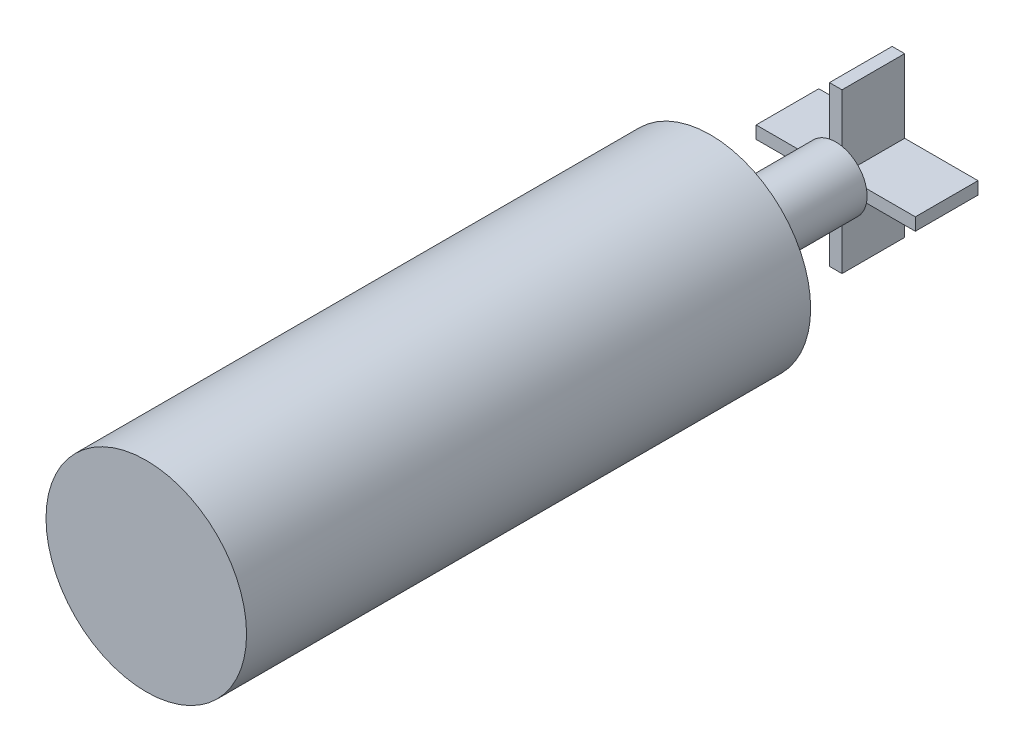
ISO-10303-21;
HEADER;
FILE_DESCRIPTION(('STEP AP214'),'2;1');
FILE_NAME('part.step','',(''),(''),'','','');
FILE_SCHEMA(('AUTOMOTIVE_DESIGN { 1 0 10303 214 1 1 1 1 }'));
ENDSEC;
DATA;
#1=APPLICATION_CONTEXT('core data for automotive mechanical design processes');
#2=APPLICATION_PROTOCOL_DEFINITION('international standard','automotive_design',2000,#1);
#3=PRODUCT_CONTEXT('',#1,'mechanical');
#4=PRODUCT('Part','Part','',(#3));
#5=PRODUCT_RELATED_PRODUCT_CATEGORY('part','',(#4));
#6=PRODUCT_DEFINITION_FORMATION('','',#4);
#7=PRODUCT_DEFINITION_CONTEXT('part definition',#1,'design');
#8=PRODUCT_DEFINITION('design','',#6,#7);
#9=PRODUCT_DEFINITION_SHAPE('','',#8);
#10=(LENGTH_UNIT() NAMED_UNIT(*) SI_UNIT(.MILLI.,.METRE.));
#11=(NAMED_UNIT(*) PLANE_ANGLE_UNIT() SI_UNIT($,.RADIAN.));
#12=(NAMED_UNIT(*) SI_UNIT($,.STERADIAN.) SOLID_ANGLE_UNIT());
#13=UNCERTAINTY_MEASURE_WITH_UNIT(LENGTH_MEASURE(1.E-05),#10,'distance_accuracy_value','');
#14=(GEOMETRIC_REPRESENTATION_CONTEXT(3) GLOBAL_UNCERTAINTY_ASSIGNED_CONTEXT((#13)) GLOBAL_UNIT_ASSIGNED_CONTEXT((#10,
#11,#12)) REPRESENTATION_CONTEXT('',''));
#15=CARTESIAN_POINT('',(0.,0.,0.));
#16=DIRECTION('',(0.,0.,1.));
#17=DIRECTION('',(1.,0.,0.));
#18=AXIS2_PLACEMENT_3D('',#15,#16,#17);
#19=CARTESIAN_POINT('',(0.,0.,-20.));
#20=DIRECTION('',(0.,0.,-1.));
#21=DIRECTION('',(-1.,0.,0.));
#22=AXIS2_PLACEMENT_3D('',#19,#20,#21);
#23=PLANE('',#22);
#24=DIRECTION('',(-1.,0.,0.));
#25=VECTOR('',#24,1.);
#26=CARTESIAN_POINT('',(-1.,-1.,-20.));
#27=LINE('',#26,#25);
#28=CARTESIAN_POINT('',(-1.,-1.,-20.));
#29=VERTEX_POINT('',#28);
#30=CARTESIAN_POINT('',(-4.89897948556636,-1.,-20.));
#31=VERTEX_POINT('',#30);
#32=EDGE_CURVE('E53',#29,#31,#27,.T.);
#33=ORIENTED_EDGE('',*,*,#32,.F.);
#34=DIRECTION('',(0.,1.,0.));
#35=VECTOR('',#34,1.);
#36=CARTESIAN_POINT('',(-1.,-1.,-20.));
#37=LINE('',#36,#35);
#38=CARTESIAN_POINT('',(-1.,-4.89897948556636,-20.));
#39=VERTEX_POINT('',#38);
#40=EDGE_CURVE('E11',#39,#29,#37,.T.);
#41=ORIENTED_EDGE('',*,*,#40,.F.);
#42=CARTESIAN_POINT('',(0.,0.,-20.));
#43=DIRECTION('',(0.,0.,-1.));
#44=DIRECTION('',(-1.,0.,0.));
#45=AXIS2_PLACEMENT_3D('',#42,#43,#44);
#46=CIRCLE('',#45,5.);
#47=EDGE_CURVE('E179',#39,#31,#46,.T.);
#48=ORIENTED_EDGE('',*,*,#47,.T.);
#49=EDGE_LOOP('',(#33,#41,#48));
#50=FACE_BOUND('',#49,.T.);
#51=ADVANCED_FACE('F35',(#50),#23,.T.);
#52=DIRECTION('',(0.,-1.,0.));
#53=VECTOR('',#52,1.);
#54=CARTESIAN_POINT('',(1.,-1.,-20.));
#55=LINE('',#54,#53);
#56=CARTESIAN_POINT('',(1.,-1.,-20.));
#57=VERTEX_POINT('',#56);
#58=CARTESIAN_POINT('',(1.,-4.89897948556636,-20.));
#59=VERTEX_POINT('',#58);
#60=EDGE_CURVE('E60',#57,#59,#55,.T.);
#61=ORIENTED_EDGE('',*,*,#60,.F.);
#62=DIRECTION('',(-1.,0.,0.));
#63=VECTOR('',#62,1.);
#64=CARTESIAN_POINT('',(12.7,-1.,-20.));
#65=LINE('',#64,#63);
#66=CARTESIAN_POINT('',(4.89897948556636,-1.,-20.));
#67=VERTEX_POINT('',#66);
#68=EDGE_CURVE('E44',#67,#57,#65,.T.);
#69=ORIENTED_EDGE('',*,*,#68,.F.);
#70=EDGE_CURVE('E366',#67,#59,#46,.T.);
#71=ORIENTED_EDGE('',*,*,#70,.T.);
#72=EDGE_LOOP('',(#61,#69,#71));
#73=FACE_BOUND('',#72,.T.);
#74=ADVANCED_FACE('F214',(#73),#23,.T.);
#75=DIRECTION('',(1.,0.,0.));
#76=VECTOR('',#75,1.);
#77=CARTESIAN_POINT('',(12.7,1.,-20.));
#78=LINE('',#77,#76);
#79=CARTESIAN_POINT('',(1.,1.,-20.));
#80=VERTEX_POINT('',#79);
#81=CARTESIAN_POINT('',(4.89897948556636,1.,-20.));
#82=VERTEX_POINT('',#81);
#83=EDGE_CURVE('E239',#80,#82,#78,.T.);
#84=ORIENTED_EDGE('',*,*,#83,.F.);
#85=DIRECTION('',(0.,-1.,0.));
#86=VECTOR('',#85,1.);
#87=CARTESIAN_POINT('',(1.,12.7,-20.));
#88=LINE('',#87,#86);
#89=CARTESIAN_POINT('',(1.,4.89897948556636,-20.));
#90=VERTEX_POINT('',#89);
#91=EDGE_CURVE('E241',#90,#80,#88,.T.);
#92=ORIENTED_EDGE('',*,*,#91,.F.);
#93=EDGE_CURVE('E243',#90,#82,#46,.T.);
#94=ORIENTED_EDGE('',*,*,#93,.T.);
#95=EDGE_LOOP('',(#84,#92,#94));
#96=FACE_BOUND('',#95,.T.);
#97=ADVANCED_FACE('F219',(#96),#23,.T.);
#98=CARTESIAN_POINT('',(0.,0.,90.));
#99=DIRECTION('',(0.,0.,-1.));
#100=DIRECTION('',(-1.,0.,0.));
#101=AXIS2_PLACEMENT_3D('',#98,#99,#100);
#102=CYLINDRICAL_SURFACE('',#101,16.);
#103=CARTESIAN_POINT('',(0.,0.,90.));
#104=DIRECTION('',(0.,0.,1.));
#105=DIRECTION('',(1.,0.,0.));
#106=AXIS2_PLACEMENT_3D('',#103,#104,#105);
#107=CIRCLE('',#106,16.);
#108=CARTESIAN_POINT('',(-16.,0.,90.));
#109=VERTEX_POINT('',#108);
#110=EDGE_CURVE('E191',#109,#109,#107,.T.);
#111=CARTESIAN_POINT('',(0.,0.,0.));
#112=DIRECTION('',(0.,0.,1.));
#113=DIRECTION('',(1.,0.,0.));
#114=AXIS2_PLACEMENT_3D('',#111,#112,#113);
#115=CIRCLE('',#114,16.);
#116=CARTESIAN_POINT('',(-16.,0.,0.));
#117=VERTEX_POINT('',#116);
#118=EDGE_CURVE('E39',#117,#117,#115,.T.);
#119=CARTESIAN_POINT('',(-16.,0.,90.));
#120=CARTESIAN_POINT('',(-16.,0.,89.0625));
#121=CARTESIAN_POINT('',(-16.,0.,88.125));
#122=CARTESIAN_POINT('',(-16.,0.,86.25));
#123=CARTESIAN_POINT('',(-16.,0.,85.3125));
#124=CARTESIAN_POINT('',(-16.,0.,83.4375));
#125=CARTESIAN_POINT('',(-16.,0.,82.5));
#126=CARTESIAN_POINT('',(-16.,0.,80.625));
#127=CARTESIAN_POINT('',(-16.,0.,79.6875));
#128=CARTESIAN_POINT('',(-16.,0.,77.8125));
#129=CARTESIAN_POINT('',(-16.,0.,76.875));
#130=CARTESIAN_POINT('',(-16.,0.,75.));
#131=CARTESIAN_POINT('',(-16.,0.,74.0625));
#132=CARTESIAN_POINT('',(-16.,0.,72.1875));
#133=CARTESIAN_POINT('',(-16.,0.,71.25));
#134=CARTESIAN_POINT('',(-16.,0.,69.375));
#135=CARTESIAN_POINT('',(-16.,0.,68.4375));
#136=CARTESIAN_POINT('',(-16.,0.,66.5625));
#137=CARTESIAN_POINT('',(-16.,0.,65.625));
#138=CARTESIAN_POINT('',(-16.,0.,63.75));
#139=CARTESIAN_POINT('',(-16.,0.,62.8125));
#140=CARTESIAN_POINT('',(-16.,0.,60.9375));
#141=CARTESIAN_POINT('',(-16.,0.,60.));
#142=CARTESIAN_POINT('',(-16.,0.,58.125));
#143=CARTESIAN_POINT('',(-16.,0.,57.1875));
#144=CARTESIAN_POINT('',(-16.,0.,55.3125));
#145=CARTESIAN_POINT('',(-16.,0.,54.375));
#146=CARTESIAN_POINT('',(-16.,0.,52.5));
#147=CARTESIAN_POINT('',(-16.,0.,51.5625));
#148=CARTESIAN_POINT('',(-16.,0.,49.6875));
#149=CARTESIAN_POINT('',(-16.,0.,48.75));
#150=CARTESIAN_POINT('',(-16.,0.,46.875));
#151=CARTESIAN_POINT('',(-16.,0.,45.9375));
#152=CARTESIAN_POINT('',(-16.,0.,44.0625));
#153=CARTESIAN_POINT('',(-16.,0.,43.125));
#154=CARTESIAN_POINT('',(-16.,0.,41.25));
#155=CARTESIAN_POINT('',(-16.,0.,40.3125));
#156=CARTESIAN_POINT('',(-16.,0.,38.4375));
#157=CARTESIAN_POINT('',(-16.,0.,37.5));
#158=CARTESIAN_POINT('',(-16.,0.,35.625));
#159=CARTESIAN_POINT('',(-16.,0.,34.6875));
#160=CARTESIAN_POINT('',(-16.,0.,32.8125));
#161=CARTESIAN_POINT('',(-16.,0.,31.875));
#162=CARTESIAN_POINT('',(-16.,0.,30.));
#163=CARTESIAN_POINT('',(-16.,0.,29.0625));
#164=CARTESIAN_POINT('',(-16.,0.,27.1875));
#165=CARTESIAN_POINT('',(-16.,0.,26.25));
#166=CARTESIAN_POINT('',(-16.,0.,24.375));
#167=CARTESIAN_POINT('',(-16.,0.,23.4375));
#168=CARTESIAN_POINT('',(-16.,0.,21.5625));
#169=CARTESIAN_POINT('',(-16.,0.,20.625));
#170=CARTESIAN_POINT('',(-16.,0.,18.75));
#171=CARTESIAN_POINT('',(-16.,0.,17.8125));
#172=CARTESIAN_POINT('',(-16.,0.,15.9375));
#173=CARTESIAN_POINT('',(-16.,0.,15.));
#174=CARTESIAN_POINT('',(-16.,0.,13.125));
#175=CARTESIAN_POINT('',(-16.,0.,12.1875));
#176=CARTESIAN_POINT('',(-16.,0.,10.3125));
#177=CARTESIAN_POINT('',(-16.,0.,9.37499999999999));
#178=CARTESIAN_POINT('',(-16.,0.,7.49999999999999));
#179=CARTESIAN_POINT('',(-16.,0.,6.56249999999999));
#180=CARTESIAN_POINT('',(-16.,0.,4.68749999999999));
#181=CARTESIAN_POINT('',(-16.,0.,3.74999999999998));
#182=CARTESIAN_POINT('',(-16.,0.,1.87499999999998));
#183=CARTESIAN_POINT('',(-16.,0.,0.937499999999986));
#184=CARTESIAN_POINT('',(-16.,0.,0.));
#185=B_SPLINE_CURVE_WITH_KNOTS('',3,(#119,#120,#121,#122,#123,#124,#125,#126,#127,#128,#129,
#130,#131,#132,#133,#134,#135,#136,#137,#138,#139,#140,#141,#142,#143,#144,#145,#146,#147,#148,
#149,#150,#151,#152,#153,#154,#155,#156,#157,#158,#159,#160,#161,#162,#163,#164,#165,#166,#167,
#168,#169,#170,#171,#172,#173,#174,#175,#176,#177,#178,#179,#180,#181,#182,#183,#184),
.UNSPECIFIED.,.F.,.F.,(4,2,2,2,2,2,2,2,2,2,2,2,2,2,2,2,2,2,2,2,2,2,2,2,2,2,2,2,2,2,2,2,4),(0.,
2.81250000000001,5.62500000000001,8.43750000000001,11.25,14.0625,16.875,19.6875,22.5,25.3125,
28.125,30.9375,33.75,36.5625,39.375,42.1875,45.,47.8125,50.625,53.4375,56.25,59.0625,61.875,
64.6875,67.5,70.3125,73.125,75.9375,78.75,81.5625,84.375,87.1875,90.),.UNSPECIFIED.);
#186=EDGE_CURVE('BSEAM37',#109,#117,#185,.T.);
#187=ORIENTED_EDGE('',*,*,#110,.F.);
#188=ORIENTED_EDGE('',*,*,#118,.T.);
#189=ORIENTED_EDGE('',*,*,#186,.T.);
#190=ORIENTED_EDGE('',*,*,#186,.F.);
#191=EDGE_LOOP('',(#187,#189,#188,#190));
#192=FACE_BOUND('',#191,.T.);
#193=ADVANCED_FACE('F37',(#192),#102,.T.);
#194=CARTESIAN_POINT('',(0.,0.,90.));
#195=DIRECTION('',(0.,0.,1.));
#196=DIRECTION('',(1.,0.,0.));
#197=AXIS2_PLACEMENT_3D('',#194,#195,#196);
#198=PLANE('',#197);
#199=ORIENTED_EDGE('',*,*,#110,.T.);
#200=EDGE_LOOP('',(#199));
#201=FACE_BOUND('',#200,.T.);
#202=ADVANCED_FACE('F202',(#201),#198,.T.);
#203=CARTESIAN_POINT('',(0.,0.,0.));
#204=DIRECTION('',(0.,0.,1.));
#205=DIRECTION('',(1.,0.,0.));
#206=AXIS2_PLACEMENT_3D('',#203,#204,#205);
#207=PLANE('',#206);
#208=CARTESIAN_POINT('',(0.,0.,0.));
#209=DIRECTION('',(0.,0.,-1.));
#210=DIRECTION('',(-1.,0.,0.));
#211=AXIS2_PLACEMENT_3D('',#208,#209,#210);
#212=CIRCLE('',#211,5.);
#213=CARTESIAN_POINT('',(-5.,0.,0.));
#214=VERTEX_POINT('',#213);
#215=EDGE_CURVE('E188',#214,#214,#212,.T.);
#216=ORIENTED_EDGE('',*,*,#215,.F.);
#217=EDGE_LOOP('',(#216));
#218=FACE_BOUND('',#217,.T.);
#219=ORIENTED_EDGE('',*,*,#118,.F.);
#220=EDGE_LOOP('',(#219));
#221=FACE_BOUND('',#220,.T.);
#222=ADVANCED_FACE('F199',(#218,#221),#207,.F.);
#223=CARTESIAN_POINT('',(0.,0.,-20.));
#224=DIRECTION('',(0.,0.,1.));
#225=DIRECTION('',(1.,0.,0.));
#226=AXIS2_PLACEMENT_3D('',#223,#224,#225);
#227=CYLINDRICAL_SURFACE('',#226,5.);
#228=CARTESIAN_POINT('',(-4.89897948556636,1.,-20.));
#229=VERTEX_POINT('',#228);
#230=CARTESIAN_POINT('',(-0.999999999999999,4.89897948556636,-20.));
#231=VERTEX_POINT('',#230);
#232=EDGE_CURVE('E181',#229,#231,#46,.T.);
#233=ORIENTED_EDGE('',*,*,#232,.F.);
#234=EDGE_CURVE('E176',#31,#229,#46,.T.);
#235=ORIENTED_EDGE('',*,*,#234,.F.);
#236=ORIENTED_EDGE('',*,*,#47,.F.);
#237=EDGE_CURVE('E372',#59,#39,#46,.T.);
#238=ORIENTED_EDGE('',*,*,#237,.F.);
#239=ORIENTED_EDGE('',*,*,#70,.F.);
#240=EDGE_CURVE('E369',#82,#67,#46,.T.);
#241=ORIENTED_EDGE('',*,*,#240,.F.);
#242=ORIENTED_EDGE('',*,*,#93,.F.);
#243=EDGE_CURVE('E187',#231,#90,#46,.T.);
#244=ORIENTED_EDGE('',*,*,#243,.F.);
#245=EDGE_LOOP('',(#233,#235,#236,#238,#239,#241,#242,#244));
#246=FACE_BOUND('',#245,.T.);
#247=ORIENTED_EDGE('',*,*,#215,.T.);
#248=EDGE_LOOP('',(#247));
#249=FACE_BOUND('',#248,.T.);
#250=ADVANCED_FACE('F201',(#246,#249),#227,.T.);
#251=DIRECTION('',(0.,1.,0.));
#252=VECTOR('',#251,1.);
#253=CARTESIAN_POINT('',(-0.999999999999999,12.7,-20.));
#254=LINE('',#253,#252);
#255=CARTESIAN_POINT('',(-1.,1.,-20.));
#256=VERTEX_POINT('',#255);
#257=EDGE_CURVE('E281',#256,#231,#254,.T.);
#258=ORIENTED_EDGE('',*,*,#257,.F.);
#259=DIRECTION('',(1.,0.,0.));
#260=VECTOR('',#259,1.);
#261=CARTESIAN_POINT('',(-1.,1.,-20.));
#262=LINE('',#261,#260);
#263=EDGE_CURVE('E190',#229,#256,#262,.T.);
#264=ORIENTED_EDGE('',*,*,#263,.F.);
#265=ORIENTED_EDGE('',*,*,#232,.T.);
#266=EDGE_LOOP('',(#258,#264,#265));
#267=FACE_BOUND('',#266,.T.);
#268=ADVANCED_FACE('F208',(#267),#23,.T.);
#269=CARTESIAN_POINT('',(0.,0.,-20.));
#270=DIRECTION('',(0.,0.,1.));
#271=DIRECTION('',(1.,0.,0.));
#272=AXIS2_PLACEMENT_3D('',#269,#270,#271);
#273=PLANE('',#272);
#274=CARTESIAN_POINT('',(-0.999999999999999,12.7,-20.));
#275=VERTEX_POINT('',#274);
#276=EDGE_CURVE('E294',#231,#275,#254,.T.);
#277=ORIENTED_EDGE('',*,*,#276,.F.);
#278=ORIENTED_EDGE('',*,*,#243,.T.);
#279=CARTESIAN_POINT('',(1.,12.7,-20.));
#280=VERTEX_POINT('',#279);
#281=EDGE_CURVE('E259',#280,#90,#88,.T.);
#282=ORIENTED_EDGE('',*,*,#281,.F.);
#283=DIRECTION('',(1.,0.,0.));
#284=VECTOR('',#283,1.);
#285=CARTESIAN_POINT('',(1.,12.7,-20.));
#286=LINE('',#285,#284);
#287=EDGE_CURVE('E320',#275,#280,#286,.T.);
#288=ORIENTED_EDGE('',*,*,#287,.F.);
#289=EDGE_LOOP('',(#277,#278,#282,#288));
#290=FACE_BOUND('',#289,.T.);
#291=ADVANCED_FACE('F222',(#290),#273,.T.);
#292=CARTESIAN_POINT('',(12.7,1.,-20.));
#293=VERTEX_POINT('',#292);
#294=EDGE_CURVE('E248',#82,#293,#78,.T.);
#295=ORIENTED_EDGE('',*,*,#294,.F.);
#296=ORIENTED_EDGE('',*,*,#240,.T.);
#297=CARTESIAN_POINT('',(12.7,-1.,-20.));
#298=VERTEX_POINT('',#297);
#299=EDGE_CURVE('E361',#298,#67,#65,.T.);
#300=ORIENTED_EDGE('',*,*,#299,.F.);
#301=DIRECTION('',(0.,-1.,0.));
#302=VECTOR('',#301,1.);
#303=CARTESIAN_POINT('',(12.7,1.,-20.));
#304=LINE('',#303,#302);
#305=EDGE_CURVE('E247',#293,#298,#304,.T.);
#306=ORIENTED_EDGE('',*,*,#305,.F.);
#307=EDGE_LOOP('',(#295,#296,#300,#306));
#308=FACE_BOUND('',#307,.T.);
#309=ADVANCED_FACE('F227',(#308),#273,.T.);
#310=CARTESIAN_POINT('',(0.999999999999999,-12.7,-20.));
#311=VERTEX_POINT('',#310);
#312=EDGE_CURVE('E344',#59,#311,#55,.T.);
#313=ORIENTED_EDGE('',*,*,#312,.F.);
#314=ORIENTED_EDGE('',*,*,#237,.T.);
#315=CARTESIAN_POINT('',(-1.,-12.7,-20.));
#316=VERTEX_POINT('',#315);
#317=EDGE_CURVE('E46',#316,#39,#37,.T.);
#318=ORIENTED_EDGE('',*,*,#317,.F.);
#319=DIRECTION('',(-1.,0.,0.));
#320=VECTOR('',#319,1.);
#321=CARTESIAN_POINT('',(0.999999999999999,-12.7,-20.));
#322=LINE('',#321,#320);
#323=EDGE_CURVE('E351',#311,#316,#322,.T.);
#324=ORIENTED_EDGE('',*,*,#323,.F.);
#325=EDGE_LOOP('',(#313,#314,#318,#324));
#326=FACE_BOUND('',#325,.T.);
#327=ADVANCED_FACE('F377',(#326),#273,.T.);
#328=CARTESIAN_POINT('',(-1.,-1.,-30.));
#329=DIRECTION('',(0.,1.,0.));
#330=DIRECTION('',(0.,0.,1.));
#331=AXIS2_PLACEMENT_3D('',#328,#329,#330);
#332=PLANE('',#331);
#333=ORIENTED_EDGE('',*,*,#32,.T.);
#334=CARTESIAN_POINT('',(-12.7,-1.,-20.));
#335=VERTEX_POINT('',#334);
#336=EDGE_CURVE('E174',#31,#335,#27,.T.);
#337=ORIENTED_EDGE('',*,*,#336,.T.);
#338=DIRECTION('',(0.,0.,1.));
#339=VECTOR('',#338,1.);
#340=CARTESIAN_POINT('',(-12.7,-1.,-30.));
#341=LINE('',#340,#339);
#342=CARTESIAN_POINT('',(-12.7,-1.,-30.));
#343=VERTEX_POINT('',#342);
#344=EDGE_CURVE('E156',#343,#335,#341,.T.);
#345=ORIENTED_EDGE('',*,*,#344,.F.);
#346=DIRECTION('',(-1.,0.,0.));
#347=VECTOR('',#346,1.);
#348=CARTESIAN_POINT('',(-1.,-1.,-30.));
#349=LINE('',#348,#347);
#350=CARTESIAN_POINT('',(-1.,-1.,-30.));
#351=VERTEX_POINT('',#350);
#352=EDGE_CURVE('E162',#351,#343,#349,.T.);
#353=ORIENTED_EDGE('',*,*,#352,.F.);
#354=DIRECTION('',(0.,0.,1.));
#355=VECTOR('',#354,1.);
#356=CARTESIAN_POINT('',(-1.,-1.,-30.));
#357=LINE('',#356,#355);
#358=EDGE_CURVE('E299',#351,#29,#357,.T.);
#359=ORIENTED_EDGE('',*,*,#358,.T.);
#360=EDGE_LOOP('',(#333,#337,#345,#353,#359));
#361=FACE_BOUND('',#360,.T.);
#362=ADVANCED_FACE('F172',(#361),#332,.F.);
#363=CARTESIAN_POINT('',(-12.7,1.,-30.));
#364=DIRECTION('',(1.,0.,0.));
#365=DIRECTION('',(0.,0.,-1.));
#366=AXIS2_PLACEMENT_3D('',#363,#364,#365);
#367=PLANE('',#366);
#368=DIRECTION('',(0.,1.,0.));
#369=VECTOR('',#368,1.);
#370=CARTESIAN_POINT('',(-12.7,1.,-20.));
#371=LINE('',#370,#369);
#372=CARTESIAN_POINT('',(-12.7,1.,-20.));
#373=VERTEX_POINT('',#372);
#374=EDGE_CURVE('E295',#335,#373,#371,.T.);
#375=ORIENTED_EDGE('',*,*,#374,.T.);
#376=DIRECTION('',(0.,0.,1.));
#377=VECTOR('',#376,1.);
#378=CARTESIAN_POINT('',(-12.7,1.,-30.));
#379=LINE('',#378,#377);
#380=CARTESIAN_POINT('',(-12.7,1.,-30.));
#381=VERTEX_POINT('',#380);
#382=EDGE_CURVE('E158',#381,#373,#379,.T.);
#383=ORIENTED_EDGE('',*,*,#382,.F.);
#384=DIRECTION('',(0.,1.,0.));
#385=VECTOR('',#384,1.);
#386=CARTESIAN_POINT('',(-12.7,1.,-30.));
#387=LINE('',#386,#385);
#388=EDGE_CURVE('E152',#343,#381,#387,.T.);
#389=ORIENTED_EDGE('',*,*,#388,.F.);
#390=ORIENTED_EDGE('',*,*,#344,.T.);
#391=EDGE_LOOP('',(#375,#383,#389,#390));
#392=FACE_BOUND('',#391,.T.);
#393=ADVANCED_FACE('F154',(#392),#367,.F.);
#394=CARTESIAN_POINT('',(-1.,1.,-30.));
#395=DIRECTION('',(0.,-1.,0.));
#396=DIRECTION('',(1.,0.,0.));
#397=AXIS2_PLACEMENT_3D('',#394,#395,#396);
#398=PLANE('',#397);
#399=EDGE_CURVE('E289',#373,#229,#262,.T.);
#400=ORIENTED_EDGE('',*,*,#399,.T.);
#401=ORIENTED_EDGE('',*,*,#263,.T.);
#402=DIRECTION('',(0.,0.,1.));
#403=VECTOR('',#402,1.);
#404=CARTESIAN_POINT('',(-1.,1.,-30.));
#405=LINE('',#404,#403);
#406=CARTESIAN_POINT('',(-1.,1.,-30.));
#407=VERTEX_POINT('',#406);
#408=EDGE_CURVE('E182',#407,#256,#405,.T.);
#409=ORIENTED_EDGE('',*,*,#408,.F.);
#410=DIRECTION('',(1.,0.,0.));
#411=VECTOR('',#410,1.);
#412=CARTESIAN_POINT('',(-1.,1.,-30.));
#413=LINE('',#412,#411);
#414=EDGE_CURVE('E161',#381,#407,#413,.T.);
#415=ORIENTED_EDGE('',*,*,#414,.F.);
#416=ORIENTED_EDGE('',*,*,#382,.T.);
#417=EDGE_LOOP('',(#400,#401,#409,#415,#416));
#418=FACE_BOUND('',#417,.T.);
#419=ADVANCED_FACE('F287',(#418),#398,.F.);
#420=CARTESIAN_POINT('',(-0.999999999999999,12.7,-30.));
#421=DIRECTION('',(1.,0.,0.));
#422=DIRECTION('',(0.,1.,0.));
#423=AXIS2_PLACEMENT_3D('',#420,#421,#422);
#424=PLANE('',#423);
#425=ORIENTED_EDGE('',*,*,#257,.T.);
#426=ORIENTED_EDGE('',*,*,#276,.T.);
#427=DIRECTION('',(0.,0.,1.));
#428=VECTOR('',#427,1.);
#429=CARTESIAN_POINT('',(-0.999999999999999,12.7,-30.));
#430=LINE('',#429,#428);
#431=CARTESIAN_POINT('',(-0.999999999999999,12.7,-30.));
#432=VERTEX_POINT('',#431);
#433=EDGE_CURVE('E267',#432,#275,#430,.T.);
#434=ORIENTED_EDGE('',*,*,#433,.F.);
#435=DIRECTION('',(0.,1.,0.));
#436=VECTOR('',#435,1.);
#437=CARTESIAN_POINT('',(-0.999999999999999,12.7,-30.));
#438=LINE('',#437,#436);
#439=EDGE_CURVE('E283',#407,#432,#438,.T.);
#440=ORIENTED_EDGE('',*,*,#439,.F.);
#441=ORIENTED_EDGE('',*,*,#408,.T.);
#442=EDGE_LOOP('',(#425,#426,#434,#440,#441));
#443=FACE_BOUND('',#442,.T.);
#444=ADVANCED_FACE('F280',(#443),#424,.F.);
#445=CARTESIAN_POINT('',(1.,12.7,-30.));
#446=DIRECTION('',(0.,-1.,0.));
#447=DIRECTION('',(0.,0.,-1.));
#448=AXIS2_PLACEMENT_3D('',#445,#446,#447);
#449=PLANE('',#448);
#450=ORIENTED_EDGE('',*,*,#287,.T.);
#451=DIRECTION('',(0.,0.,1.));
#452=VECTOR('',#451,1.);
#453=CARTESIAN_POINT('',(1.,12.7,-30.));
#454=LINE('',#453,#452);
#455=CARTESIAN_POINT('',(1.,12.7,-30.));
#456=VERTEX_POINT('',#455);
#457=EDGE_CURVE('E264',#456,#280,#454,.T.);
#458=ORIENTED_EDGE('',*,*,#457,.F.);
#459=DIRECTION('',(1.,0.,0.));
#460=VECTOR('',#459,1.);
#461=CARTESIAN_POINT('',(1.,12.7,-30.));
#462=LINE('',#461,#460);
#463=EDGE_CURVE('E311',#432,#456,#462,.T.);
#464=ORIENTED_EDGE('',*,*,#463,.F.);
#465=ORIENTED_EDGE('',*,*,#433,.T.);
#466=EDGE_LOOP('',(#450,#458,#464,#465));
#467=FACE_BOUND('',#466,.T.);
#468=ADVANCED_FACE('F319',(#467),#449,.F.);
#469=CARTESIAN_POINT('',(1.,12.7,-30.));
#470=DIRECTION('',(-1.,0.,0.));
#471=DIRECTION('',(0.,-1.,0.));
#472=AXIS2_PLACEMENT_3D('',#469,#470,#471);
#473=PLANE('',#472);
#474=ORIENTED_EDGE('',*,*,#281,.T.);
#475=ORIENTED_EDGE('',*,*,#91,.T.);
#476=DIRECTION('',(0.,0.,1.));
#477=VECTOR('',#476,1.);
#478=CARTESIAN_POINT('',(1.,1.,-30.));
#479=LINE('',#478,#477);
#480=CARTESIAN_POINT('',(1.,1.,-30.));
#481=VERTEX_POINT('',#480);
#482=EDGE_CURVE('E255',#481,#80,#479,.T.);
#483=ORIENTED_EDGE('',*,*,#482,.F.);
#484=DIRECTION('',(0.,-1.,0.));
#485=VECTOR('',#484,1.);
#486=CARTESIAN_POINT('',(1.,12.7,-30.));
#487=LINE('',#486,#485);
#488=EDGE_CURVE('E309',#456,#481,#487,.T.);
#489=ORIENTED_EDGE('',*,*,#488,.F.);
#490=ORIENTED_EDGE('',*,*,#457,.T.);
#491=EDGE_LOOP('',(#474,#475,#483,#489,#490));
#492=FACE_BOUND('',#491,.T.);
#493=ADVANCED_FACE('F253',(#492),#473,.F.);
#494=CARTESIAN_POINT('',(12.7,1.,-30.));
#495=DIRECTION('',(0.,-1.,0.));
#496=DIRECTION('',(1.,0.,0.));
#497=AXIS2_PLACEMENT_3D('',#494,#495,#496);
#498=PLANE('',#497);
#499=ORIENTED_EDGE('',*,*,#83,.T.);
#500=ORIENTED_EDGE('',*,*,#294,.T.);
#501=DIRECTION('',(0.,0.,1.));
#502=VECTOR('',#501,1.);
#503=CARTESIAN_POINT('',(12.7,1.,-30.));
#504=LINE('',#503,#502);
#505=CARTESIAN_POINT('',(12.7,1.,-30.));
#506=VERTEX_POINT('',#505);
#507=EDGE_CURVE('E265',#506,#293,#504,.T.);
#508=ORIENTED_EDGE('',*,*,#507,.F.);
#509=DIRECTION('',(1.,0.,0.));
#510=VECTOR('',#509,1.);
#511=CARTESIAN_POINT('',(12.7,1.,-30.));
#512=LINE('',#511,#510);
#513=EDGE_CURVE('E263',#481,#506,#512,.T.);
#514=ORIENTED_EDGE('',*,*,#513,.F.);
#515=ORIENTED_EDGE('',*,*,#482,.T.);
#516=EDGE_LOOP('',(#499,#500,#508,#514,#515));
#517=FACE_BOUND('',#516,.T.);
#518=ADVANCED_FACE('F261',(#517),#498,.F.);
#519=CARTESIAN_POINT('',(12.7,1.,-30.));
#520=DIRECTION('',(-1.,0.,0.));
#521=DIRECTION('',(0.,0.,1.));
#522=AXIS2_PLACEMENT_3D('',#519,#520,#521);
#523=PLANE('',#522);
#524=ORIENTED_EDGE('',*,*,#305,.T.);
#525=DIRECTION('',(0.,0.,1.));
#526=VECTOR('',#525,1.);
#527=CARTESIAN_POINT('',(12.7,-1.,-30.));
#528=LINE('',#527,#526);
#529=CARTESIAN_POINT('',(12.7,-1.,-30.));
#530=VERTEX_POINT('',#529);
#531=EDGE_CURVE('E270',#530,#298,#528,.T.);
#532=ORIENTED_EDGE('',*,*,#531,.F.);
#533=DIRECTION('',(0.,-1.,0.));
#534=VECTOR('',#533,1.);
#535=CARTESIAN_POINT('',(12.7,1.,-30.));
#536=LINE('',#535,#534);
#537=EDGE_CURVE('E306',#506,#530,#536,.T.);
#538=ORIENTED_EDGE('',*,*,#537,.F.);
#539=ORIENTED_EDGE('',*,*,#507,.T.);
#540=EDGE_LOOP('',(#524,#532,#538,#539));
#541=FACE_BOUND('',#540,.T.);
#542=ADVANCED_FACE('F325',(#541),#523,.F.);
#543=CARTESIAN_POINT('',(12.7,-1.,-30.));
#544=DIRECTION('',(0.,1.,0.));
#545=DIRECTION('',(0.,0.,1.));
#546=AXIS2_PLACEMENT_3D('',#543,#544,#545);
#547=PLANE('',#546);
#548=ORIENTED_EDGE('',*,*,#299,.T.);
#549=ORIENTED_EDGE('',*,*,#68,.T.);
#550=DIRECTION('',(0.,0.,1.));
#551=VECTOR('',#550,1.);
#552=CARTESIAN_POINT('',(1.,-1.,-30.));
#553=LINE('',#552,#551);
#554=CARTESIAN_POINT('',(1.,-1.,-30.));
#555=VERTEX_POINT('',#554);
#556=EDGE_CURVE('E331',#555,#57,#553,.T.);
#557=ORIENTED_EDGE('',*,*,#556,.F.);
#558=DIRECTION('',(-1.,0.,0.));
#559=VECTOR('',#558,1.);
#560=CARTESIAN_POINT('',(12.7,-1.,-30.));
#561=LINE('',#560,#559);
#562=EDGE_CURVE('E304',#530,#555,#561,.T.);
#563=ORIENTED_EDGE('',*,*,#562,.F.);
#564=ORIENTED_EDGE('',*,*,#531,.T.);
#565=EDGE_LOOP('',(#548,#549,#557,#563,#564));
#566=FACE_BOUND('',#565,.T.);
#567=ADVANCED_FACE('F333',(#566),#547,.F.);
#568=CARTESIAN_POINT('',(1.,-1.,-30.));
#569=DIRECTION('',(-1.,0.,0.));
#570=DIRECTION('',(0.,-1.,0.));
#571=AXIS2_PLACEMENT_3D('',#568,#569,#570);
#572=PLANE('',#571);
#573=ORIENTED_EDGE('',*,*,#60,.T.);
#574=ORIENTED_EDGE('',*,*,#312,.T.);
#575=DIRECTION('',(0.,0.,1.));
#576=VECTOR('',#575,1.);
#577=CARTESIAN_POINT('',(0.999999999999999,-12.7,-30.));
#578=LINE('',#577,#576);
#579=CARTESIAN_POINT('',(0.999999999999999,-12.7,-30.));
#580=VERTEX_POINT('',#579);
#581=EDGE_CURVE('E341',#580,#311,#578,.T.);
#582=ORIENTED_EDGE('',*,*,#581,.F.);
#583=DIRECTION('',(0.,-1.,0.));
#584=VECTOR('',#583,1.);
#585=CARTESIAN_POINT('',(1.,-1.,-30.));
#586=LINE('',#585,#584);
#587=EDGE_CURVE('E302',#555,#580,#586,.T.);
#588=ORIENTED_EDGE('',*,*,#587,.F.);
#589=ORIENTED_EDGE('',*,*,#556,.T.);
#590=EDGE_LOOP('',(#573,#574,#582,#588,#589));
#591=FACE_BOUND('',#590,.T.);
#592=ADVANCED_FACE('F342',(#591),#572,.F.);
#593=CARTESIAN_POINT('',(0.999999999999999,-12.7,-30.));
#594=DIRECTION('',(0.,1.,0.));
#595=DIRECTION('',(0.,0.,1.));
#596=AXIS2_PLACEMENT_3D('',#593,#594,#595);
#597=PLANE('',#596);
#598=ORIENTED_EDGE('',*,*,#323,.T.);
#599=DIRECTION('',(0.,0.,1.));
#600=VECTOR('',#599,1.);
#601=CARTESIAN_POINT('',(-1.,-12.7,-30.));
#602=LINE('',#601,#600);
#603=CARTESIAN_POINT('',(-1.,-12.7,-30.));
#604=VERTEX_POINT('',#603);
#605=EDGE_CURVE('E347',#604,#316,#602,.T.);
#606=ORIENTED_EDGE('',*,*,#605,.F.);
#607=DIRECTION('',(-1.,0.,0.));
#608=VECTOR('',#607,1.);
#609=CARTESIAN_POINT('',(0.999999999999999,-12.7,-30.));
#610=LINE('',#609,#608);
#611=EDGE_CURVE('E300',#580,#604,#610,.T.);
#612=ORIENTED_EDGE('',*,*,#611,.F.);
#613=ORIENTED_EDGE('',*,*,#581,.T.);
#614=EDGE_LOOP('',(#598,#606,#612,#613));
#615=FACE_BOUND('',#614,.T.);
#616=ADVANCED_FACE('F349',(#615),#597,.F.);
#617=CARTESIAN_POINT('',(-1.,-1.,-30.));
#618=DIRECTION('',(1.,0.,0.));
#619=DIRECTION('',(0.,1.,0.));
#620=AXIS2_PLACEMENT_3D('',#617,#618,#619);
#621=PLANE('',#620);
#622=ORIENTED_EDGE('',*,*,#317,.T.);
#623=ORIENTED_EDGE('',*,*,#40,.T.);
#624=ORIENTED_EDGE('',*,*,#358,.F.);
#625=DIRECTION('',(0.,1.,0.));
#626=VECTOR('',#625,1.);
#627=CARTESIAN_POINT('',(-1.,-1.,-30.));
#628=LINE('',#627,#626);
#629=EDGE_CURVE('E167',#604,#351,#628,.T.);
#630=ORIENTED_EDGE('',*,*,#629,.F.);
#631=ORIENTED_EDGE('',*,*,#605,.T.);
#632=EDGE_LOOP('',(#622,#623,#624,#630,#631));
#633=FACE_BOUND('',#632,.T.);
#634=ADVANCED_FACE('F356',(#633),#621,.F.);
#635=CARTESIAN_POINT('',(0.,0.,-30.));
#636=DIRECTION('',(0.,0.,1.));
#637=DIRECTION('',(1.,0.,0.));
#638=AXIS2_PLACEMENT_3D('',#635,#636,#637);
#639=PLANE('',#638);
#640=ORIENTED_EDGE('',*,*,#352,.T.);
#641=ORIENTED_EDGE('',*,*,#388,.T.);
#642=ORIENTED_EDGE('',*,*,#414,.T.);
#643=ORIENTED_EDGE('',*,*,#439,.T.);
#644=ORIENTED_EDGE('',*,*,#463,.T.);
#645=ORIENTED_EDGE('',*,*,#488,.T.);
#646=ORIENTED_EDGE('',*,*,#513,.T.);
#647=ORIENTED_EDGE('',*,*,#537,.T.);
#648=ORIENTED_EDGE('',*,*,#562,.T.);
#649=ORIENTED_EDGE('',*,*,#587,.T.);
#650=ORIENTED_EDGE('',*,*,#611,.T.);
#651=ORIENTED_EDGE('',*,*,#629,.T.);
#652=EDGE_LOOP('',(#640,#641,#642,#643,#644,#645,#646,#647,#648,#649,#650,#651));
#653=FACE_BOUND('',#652,.T.);
#654=ADVANCED_FACE('F165',(#653),#639,.F.);
#655=ORIENTED_EDGE('',*,*,#336,.F.);
#656=ORIENTED_EDGE('',*,*,#234,.T.);
#657=ORIENTED_EDGE('',*,*,#399,.F.);
#658=ORIENTED_EDGE('',*,*,#374,.F.);
#659=EDGE_LOOP('',(#655,#656,#657,#658));
#660=FACE_BOUND('',#659,.T.);
#661=ADVANCED_FACE('F230',(#660),#273,.T.);
#662=CLOSED_SHELL('',(#51,#74,#97,#193,#202,#222,#250,#268,#291,#309,#327,#362,#393,#419,#444,
#468,#493,#518,#542,#567,#592,#616,#634,#654,#661));
#663=MANIFOLD_SOLID_BREP('B2',#662);
#664=ADVANCED_BREP_SHAPE_REPRESENTATION('',(#18,#663),#14);
#665=SHAPE_DEFINITION_REPRESENTATION(#9,#664);
ENDSEC;
END-ISO-10303-21;
